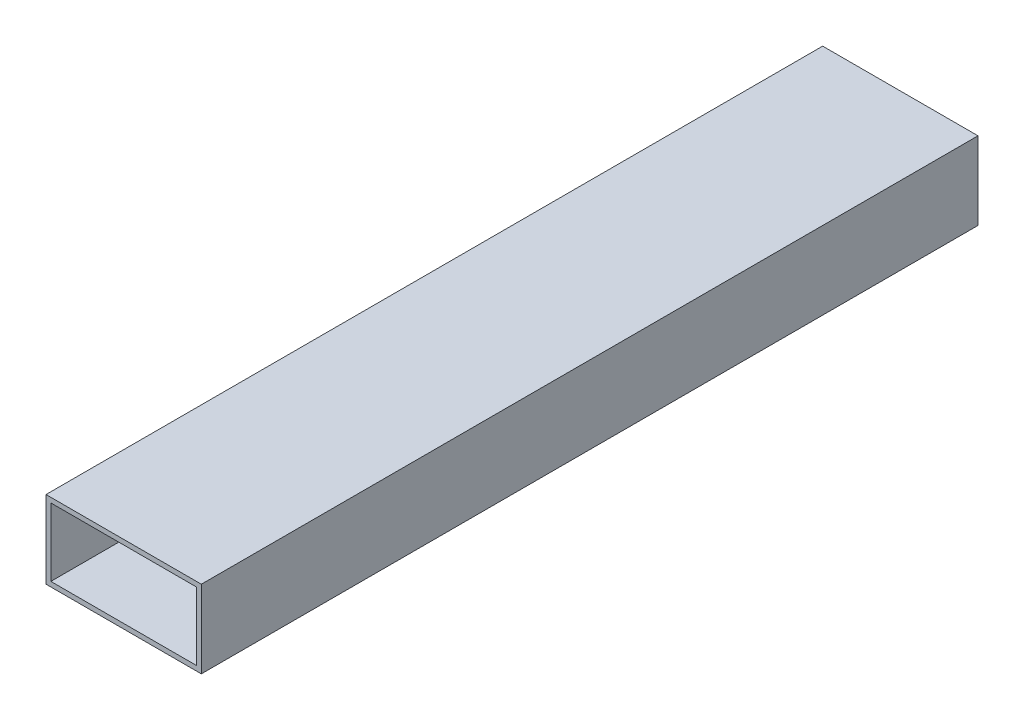
ISO-10303-21;
HEADER;
FILE_DESCRIPTION(('STEP AP214'),'2;1');
FILE_NAME('part.step','',(''),(''),'','','');
FILE_SCHEMA(('AUTOMOTIVE_DESIGN { 1 0 10303 214 1 1 1 1 }'));
ENDSEC;
DATA;
#1=APPLICATION_CONTEXT('core data for automotive mechanical design processes');
#2=APPLICATION_PROTOCOL_DEFINITION('international standard','automotive_design',2000,#1);
#3=PRODUCT_CONTEXT('',#1,'mechanical');
#4=PRODUCT('Part','Part','',(#3));
#5=PRODUCT_RELATED_PRODUCT_CATEGORY('part','',(#4));
#6=PRODUCT_DEFINITION_FORMATION('','',#4);
#7=PRODUCT_DEFINITION_CONTEXT('part definition',#1,'design');
#8=PRODUCT_DEFINITION('design','',#6,#7);
#9=PRODUCT_DEFINITION_SHAPE('','',#8);
#10=(LENGTH_UNIT() NAMED_UNIT(*) SI_UNIT(.MILLI.,.METRE.));
#11=(NAMED_UNIT(*) PLANE_ANGLE_UNIT() SI_UNIT($,.RADIAN.));
#12=(NAMED_UNIT(*) SI_UNIT($,.STERADIAN.) SOLID_ANGLE_UNIT());
#13=UNCERTAINTY_MEASURE_WITH_UNIT(LENGTH_MEASURE(1.E-05),#10,'distance_accuracy_value','');
#14=(GEOMETRIC_REPRESENTATION_CONTEXT(3) GLOBAL_UNCERTAINTY_ASSIGNED_CONTEXT((#13)) GLOBAL_UNIT_ASSIGNED_CONTEXT((#10,
#11,#12)) REPRESENTATION_CONTEXT('',''));
#15=CARTESIAN_POINT('',(0.,0.,0.));
#16=DIRECTION('',(0.,0.,1.));
#17=DIRECTION('',(1.,0.,0.));
#18=AXIS2_PLACEMENT_3D('',#15,#16,#17);
#19=CARTESIAN_POINT('',(0.,0.,254.));
#20=DIRECTION('',(0.,0.,1.));
#21=DIRECTION('',(1.,0.,0.));
#22=AXIS2_PLACEMENT_3D('',#19,#20,#21);
#23=PLANE('',#22);
#24=DIRECTION('',(0.,-1.,0.));
#25=VECTOR('',#24,1.);
#26=CARTESIAN_POINT('',(-25.4,-12.7,254.));
#27=LINE('',#26,#25);
#28=CARTESIAN_POINT('',(-25.4,12.7,254.));
#29=VERTEX_POINT('',#28);
#30=CARTESIAN_POINT('',(-25.4,-12.7,254.));
#31=VERTEX_POINT('',#30);
#32=EDGE_CURVE('E134',#29,#31,#27,.T.);
#33=ORIENTED_EDGE('',*,*,#32,.T.);
#34=DIRECTION('',(1.,0.,0.));
#35=VECTOR('',#34,1.);
#36=CARTESIAN_POINT('',(25.4,-12.7,254.));
#37=LINE('',#36,#35);
#38=CARTESIAN_POINT('',(25.4,-12.7,254.));
#39=VERTEX_POINT('',#38);
#40=EDGE_CURVE('E137',#31,#39,#37,.T.);
#41=ORIENTED_EDGE('',*,*,#40,.T.);
#42=DIRECTION('',(0.,1.,0.));
#43=VECTOR('',#42,1.);
#44=CARTESIAN_POINT('',(25.4,-12.7,254.));
#45=LINE('',#44,#43);
#46=CARTESIAN_POINT('',(25.4,12.7,254.));
#47=VERTEX_POINT('',#46);
#48=EDGE_CURVE('E140',#39,#47,#45,.T.);
#49=ORIENTED_EDGE('',*,*,#48,.T.);
#50=DIRECTION('',(-1.,0.,0.));
#51=VECTOR('',#50,1.);
#52=CARTESIAN_POINT('',(25.4,12.7,254.));
#53=LINE('',#52,#51);
#54=EDGE_CURVE('E142',#47,#29,#53,.T.);
#55=ORIENTED_EDGE('',*,*,#54,.T.);
#56=EDGE_LOOP('',(#33,#41,#49,#55));
#57=FACE_BOUND('',#56,.T.);
#58=DIRECTION('',(1.,0.,0.));
#59=VECTOR('',#58,1.);
#60=CARTESIAN_POINT('',(23.8125,-11.1125,254.));
#61=LINE('',#60,#59);
#62=CARTESIAN_POINT('',(-23.8125,-11.1125,254.));
#63=VERTEX_POINT('',#62);
#64=CARTESIAN_POINT('',(23.8125,-11.1125,254.));
#65=VERTEX_POINT('',#64);
#66=EDGE_CURVE('E106',#63,#65,#61,.T.);
#67=ORIENTED_EDGE('',*,*,#66,.F.);
#68=DIRECTION('',(0.,-1.,0.));
#69=VECTOR('',#68,1.);
#70=CARTESIAN_POINT('',(-23.8125,-11.1125,254.));
#71=LINE('',#70,#69);
#72=CARTESIAN_POINT('',(-23.8125,11.1125,254.));
#73=VERTEX_POINT('',#72);
#74=EDGE_CURVE('E98',#73,#63,#71,.T.);
#75=ORIENTED_EDGE('',*,*,#74,.F.);
#76=DIRECTION('',(-1.,0.,0.));
#77=VECTOR('',#76,1.);
#78=CARTESIAN_POINT('',(23.8125,11.1125,254.));
#79=LINE('',#78,#77);
#80=CARTESIAN_POINT('',(23.8125,11.1125,254.));
#81=VERTEX_POINT('',#80);
#82=EDGE_CURVE('E120',#81,#73,#79,.T.);
#83=ORIENTED_EDGE('',*,*,#82,.F.);
#84=DIRECTION('',(0.,1.,0.));
#85=VECTOR('',#84,1.);
#86=CARTESIAN_POINT('',(23.8125,-11.1125,254.));
#87=LINE('',#86,#85);
#88=EDGE_CURVE('E118',#65,#81,#87,.T.);
#89=ORIENTED_EDGE('',*,*,#88,.F.);
#90=EDGE_LOOP('',(#67,#75,#83,#89));
#91=FACE_BOUND('',#90,.T.);
#92=ADVANCED_FACE('F33',(#57,#91),#23,.T.);
#93=CARTESIAN_POINT('',(0.,0.,0.));
#94=DIRECTION('',(0.,0.,1.));
#95=DIRECTION('',(1.,0.,0.));
#96=AXIS2_PLACEMENT_3D('',#93,#94,#95);
#97=PLANE('',#96);
#98=DIRECTION('',(0.,-1.,0.));
#99=VECTOR('',#98,1.);
#100=CARTESIAN_POINT('',(-25.4,-12.7,0.));
#101=LINE('',#100,#99);
#102=CARTESIAN_POINT('',(-25.4,12.7,0.));
#103=VERTEX_POINT('',#102);
#104=CARTESIAN_POINT('',(-25.4,-12.7,0.));
#105=VERTEX_POINT('',#104);
#106=EDGE_CURVE('E114',#103,#105,#101,.T.);
#107=ORIENTED_EDGE('',*,*,#106,.F.);
#108=DIRECTION('',(-1.,0.,0.));
#109=VECTOR('',#108,1.);
#110=CARTESIAN_POINT('',(25.4,12.7,0.));
#111=LINE('',#110,#109);
#112=CARTESIAN_POINT('',(25.4,12.7,0.));
#113=VERTEX_POINT('',#112);
#114=EDGE_CURVE('E138',#113,#103,#111,.T.);
#115=ORIENTED_EDGE('',*,*,#114,.F.);
#116=DIRECTION('',(0.,1.,0.));
#117=VECTOR('',#116,1.);
#118=CARTESIAN_POINT('',(25.4,-12.7,0.));
#119=LINE('',#118,#117);
#120=CARTESIAN_POINT('',(25.4,-12.7,0.));
#121=VERTEX_POINT('',#120);
#122=EDGE_CURVE('E149',#121,#113,#119,.T.);
#123=ORIENTED_EDGE('',*,*,#122,.F.);
#124=DIRECTION('',(1.,0.,0.));
#125=VECTOR('',#124,1.);
#126=CARTESIAN_POINT('',(25.4,-12.7,0.));
#127=LINE('',#126,#125);
#128=EDGE_CURVE('E147',#105,#121,#127,.T.);
#129=ORIENTED_EDGE('',*,*,#128,.F.);
#130=EDGE_LOOP('',(#107,#115,#123,#129));
#131=FACE_BOUND('',#130,.T.);
#132=DIRECTION('',(0.,-1.,0.));
#133=VECTOR('',#132,1.);
#134=CARTESIAN_POINT('',(-23.8125,-11.1125,0.));
#135=LINE('',#134,#133);
#136=CARTESIAN_POINT('',(-23.8125,11.1125,0.));
#137=VERTEX_POINT('',#136);
#138=CARTESIAN_POINT('',(-23.8125,-11.1125,0.));
#139=VERTEX_POINT('',#138);
#140=EDGE_CURVE('E56',#137,#139,#135,.T.);
#141=ORIENTED_EDGE('',*,*,#140,.T.);
#142=DIRECTION('',(1.,0.,0.));
#143=VECTOR('',#142,1.);
#144=CARTESIAN_POINT('',(23.8125,-11.1125,0.));
#145=LINE('',#144,#143);
#146=CARTESIAN_POINT('',(23.8125,-11.1125,0.));
#147=VERTEX_POINT('',#146);
#148=EDGE_CURVE('E113',#139,#147,#145,.T.);
#149=ORIENTED_EDGE('',*,*,#148,.T.);
#150=DIRECTION('',(0.,1.,0.));
#151=VECTOR('',#150,1.);
#152=CARTESIAN_POINT('',(23.8125,-11.1125,0.));
#153=LINE('',#152,#151);
#154=CARTESIAN_POINT('',(23.8125,11.1125,0.));
#155=VERTEX_POINT('',#154);
#156=EDGE_CURVE('E126',#147,#155,#153,.T.);
#157=ORIENTED_EDGE('',*,*,#156,.T.);
#158=DIRECTION('',(-1.,0.,0.));
#159=VECTOR('',#158,1.);
#160=CARTESIAN_POINT('',(23.8125,11.1125,0.));
#161=LINE('',#160,#159);
#162=EDGE_CURVE('E107',#155,#137,#161,.T.);
#163=ORIENTED_EDGE('',*,*,#162,.T.);
#164=EDGE_LOOP('',(#141,#149,#157,#163));
#165=FACE_BOUND('',#164,.T.);
#166=ADVANCED_FACE('F167',(#131,#165),#97,.F.);
#167=CARTESIAN_POINT('',(-25.4,-12.7,254.));
#168=DIRECTION('',(1.,0.,0.));
#169=DIRECTION('',(0.,0.,-1.));
#170=AXIS2_PLACEMENT_3D('',#167,#168,#169);
#171=PLANE('',#170);
#172=ORIENTED_EDGE('',*,*,#106,.T.);
#173=DIRECTION('',(0.,0.,-1.));
#174=VECTOR('',#173,1.);
#175=CARTESIAN_POINT('',(-25.4,-12.7,254.));
#176=LINE('',#175,#174);
#177=EDGE_CURVE('E11',#31,#105,#176,.T.);
#178=ORIENTED_EDGE('',*,*,#177,.F.);
#179=ORIENTED_EDGE('',*,*,#32,.F.);
#180=DIRECTION('',(0.,0.,-1.));
#181=VECTOR('',#180,1.);
#182=CARTESIAN_POINT('',(-25.4,12.7,254.));
#183=LINE('',#182,#181);
#184=EDGE_CURVE('E144',#29,#103,#183,.T.);
#185=ORIENTED_EDGE('',*,*,#184,.T.);
#186=EDGE_LOOP('',(#172,#178,#179,#185));
#187=FACE_BOUND('',#186,.T.);
#188=ADVANCED_FACE('F35',(#187),#171,.F.);
#189=CARTESIAN_POINT('',(25.4,-12.7,254.));
#190=DIRECTION('',(0.,1.,0.));
#191=DIRECTION('',(-1.,0.,0.));
#192=AXIS2_PLACEMENT_3D('',#189,#190,#191);
#193=PLANE('',#192);
#194=ORIENTED_EDGE('',*,*,#128,.T.);
#195=DIRECTION('',(0.,0.,-1.));
#196=VECTOR('',#195,1.);
#197=CARTESIAN_POINT('',(25.4,-12.7,254.));
#198=LINE('',#197,#196);
#199=EDGE_CURVE('E41',#39,#121,#198,.T.);
#200=ORIENTED_EDGE('',*,*,#199,.F.);
#201=ORIENTED_EDGE('',*,*,#40,.F.);
#202=ORIENTED_EDGE('',*,*,#177,.T.);
#203=EDGE_LOOP('',(#194,#200,#201,#202));
#204=FACE_BOUND('',#203,.T.);
#205=ADVANCED_FACE('F177',(#204),#193,.F.);
#206=CARTESIAN_POINT('',(25.4,-12.7,254.));
#207=DIRECTION('',(-1.,0.,0.));
#208=DIRECTION('',(0.,-1.,0.));
#209=AXIS2_PLACEMENT_3D('',#206,#207,#208);
#210=PLANE('',#209);
#211=ORIENTED_EDGE('',*,*,#122,.T.);
#212=DIRECTION('',(0.,0.,-1.));
#213=VECTOR('',#212,1.);
#214=CARTESIAN_POINT('',(25.4,12.7,254.));
#215=LINE('',#214,#213);
#216=EDGE_CURVE('E154',#47,#113,#215,.T.);
#217=ORIENTED_EDGE('',*,*,#216,.F.);
#218=ORIENTED_EDGE('',*,*,#48,.F.);
#219=ORIENTED_EDGE('',*,*,#199,.T.);
#220=EDGE_LOOP('',(#211,#217,#218,#219));
#221=FACE_BOUND('',#220,.T.);
#222=ADVANCED_FACE('F161',(#221),#210,.F.);
#223=CARTESIAN_POINT('',(25.4,12.7,254.));
#224=DIRECTION('',(0.,-1.,0.));
#225=DIRECTION('',(1.,0.,0.));
#226=AXIS2_PLACEMENT_3D('',#223,#224,#225);
#227=PLANE('',#226);
#228=ORIENTED_EDGE('',*,*,#114,.T.);
#229=ORIENTED_EDGE('',*,*,#184,.F.);
#230=ORIENTED_EDGE('',*,*,#54,.F.);
#231=ORIENTED_EDGE('',*,*,#216,.T.);
#232=EDGE_LOOP('',(#228,#229,#230,#231));
#233=FACE_BOUND('',#232,.T.);
#234=ADVANCED_FACE('F171',(#233),#227,.F.);
#235=CARTESIAN_POINT('',(-23.8125,-11.1125,254.));
#236=DIRECTION('',(1.,0.,0.));
#237=DIRECTION('',(0.,0.,-1.));
#238=AXIS2_PLACEMENT_3D('',#235,#236,#237);
#239=PLANE('',#238);
#240=ORIENTED_EDGE('',*,*,#140,.F.);
#241=DIRECTION('',(0.,0.,-1.));
#242=VECTOR('',#241,1.);
#243=CARTESIAN_POINT('',(-23.8125,11.1125,254.));
#244=LINE('',#243,#242);
#245=EDGE_CURVE('E102',#73,#137,#244,.T.);
#246=ORIENTED_EDGE('',*,*,#245,.F.);
#247=ORIENTED_EDGE('',*,*,#74,.T.);
#248=DIRECTION('',(0.,0.,-1.));
#249=VECTOR('',#248,1.);
#250=CARTESIAN_POINT('',(-23.8125,-11.1125,254.));
#251=LINE('',#250,#249);
#252=EDGE_CURVE('E101',#63,#139,#251,.T.);
#253=ORIENTED_EDGE('',*,*,#252,.T.);
#254=EDGE_LOOP('',(#240,#246,#247,#253));
#255=FACE_BOUND('',#254,.T.);
#256=ADVANCED_FACE('F100',(#255),#239,.T.);
#257=CARTESIAN_POINT('',(23.8125,-11.1125,254.));
#258=DIRECTION('',(0.,1.,0.));
#259=DIRECTION('',(-1.,0.,0.));
#260=AXIS2_PLACEMENT_3D('',#257,#258,#259);
#261=PLANE('',#260);
#262=ORIENTED_EDGE('',*,*,#148,.F.);
#263=ORIENTED_EDGE('',*,*,#252,.F.);
#264=ORIENTED_EDGE('',*,*,#66,.T.);
#265=DIRECTION('',(0.,0.,-1.));
#266=VECTOR('',#265,1.);
#267=CARTESIAN_POINT('',(23.8125,-11.1125,254.));
#268=LINE('',#267,#266);
#269=EDGE_CURVE('E115',#65,#147,#268,.T.);
#270=ORIENTED_EDGE('',*,*,#269,.T.);
#271=EDGE_LOOP('',(#262,#263,#264,#270));
#272=FACE_BOUND('',#271,.T.);
#273=ADVANCED_FACE('F110',(#272),#261,.T.);
#274=CARTESIAN_POINT('',(23.8125,-11.1125,254.));
#275=DIRECTION('',(-1.,0.,0.));
#276=DIRECTION('',(0.,0.,1.));
#277=AXIS2_PLACEMENT_3D('',#274,#275,#276);
#278=PLANE('',#277);
#279=ORIENTED_EDGE('',*,*,#156,.F.);
#280=ORIENTED_EDGE('',*,*,#269,.F.);
#281=ORIENTED_EDGE('',*,*,#88,.T.);
#282=DIRECTION('',(0.,0.,-1.));
#283=VECTOR('',#282,1.);
#284=CARTESIAN_POINT('',(23.8125,11.1125,254.));
#285=LINE('',#284,#283);
#286=EDGE_CURVE('E48',#81,#155,#285,.T.);
#287=ORIENTED_EDGE('',*,*,#286,.T.);
#288=EDGE_LOOP('',(#279,#280,#281,#287));
#289=FACE_BOUND('',#288,.T.);
#290=ADVANCED_FACE('F200',(#289),#278,.T.);
#291=CARTESIAN_POINT('',(23.8125,11.1125,254.));
#292=DIRECTION('',(0.,-1.,0.));
#293=DIRECTION('',(1.,0.,0.));
#294=AXIS2_PLACEMENT_3D('',#291,#292,#293);
#295=PLANE('',#294);
#296=ORIENTED_EDGE('',*,*,#162,.F.);
#297=ORIENTED_EDGE('',*,*,#286,.F.);
#298=ORIENTED_EDGE('',*,*,#82,.T.);
#299=ORIENTED_EDGE('',*,*,#245,.T.);
#300=EDGE_LOOP('',(#296,#297,#298,#299));
#301=FACE_BOUND('',#300,.T.);
#302=ADVANCED_FACE('F204',(#301),#295,.T.);
#303=CLOSED_SHELL('',(#92,#166,#188,#205,#222,#234,#256,#273,#290,#302));
#304=MANIFOLD_SOLID_BREP('B2',#303);
#305=ADVANCED_BREP_SHAPE_REPRESENTATION('',(#18,#304),#14);
#306=SHAPE_DEFINITION_REPRESENTATION(#9,#305);
ENDSEC;
END-ISO-10303-21;
